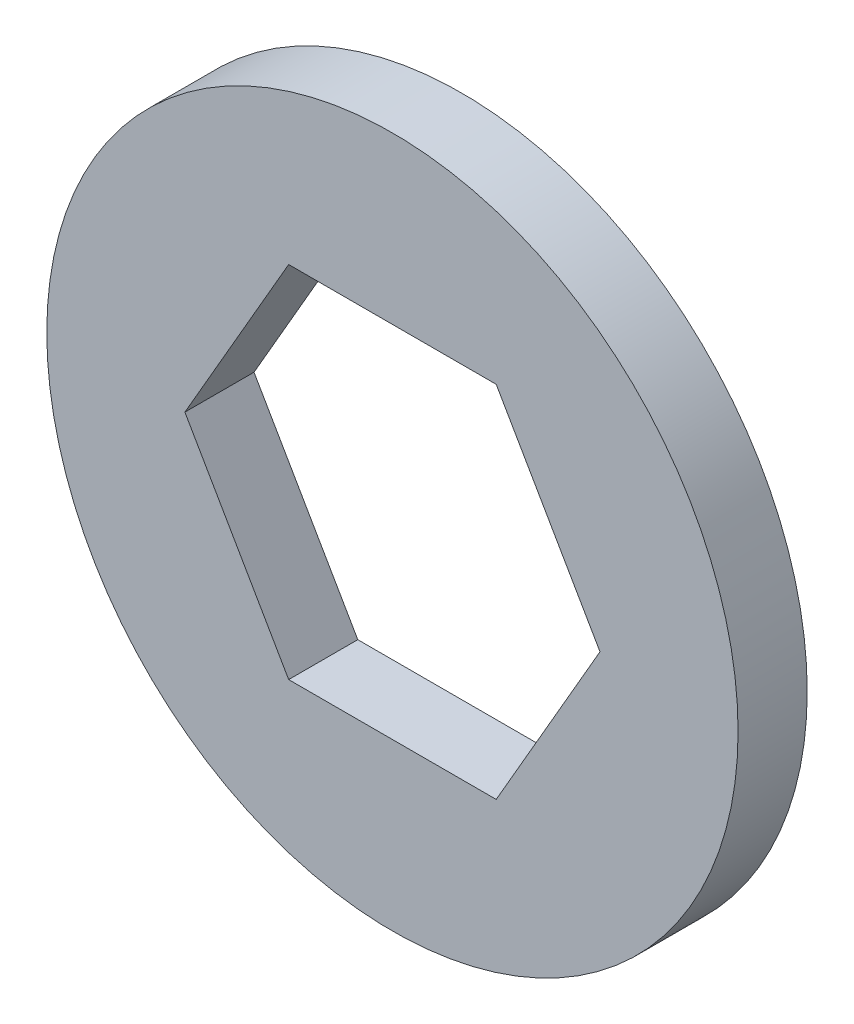
ISO-10303-21;
HEADER;
FILE_DESCRIPTION(('STEP AP214'),'2;1');
FILE_NAME('part.step','',(''),(''),'','','');
FILE_SCHEMA(('AUTOMOTIVE_DESIGN { 1 0 10303 214 1 1 1 1 }'));
ENDSEC;
DATA;
#1=APPLICATION_CONTEXT('core data for automotive mechanical design processes');
#2=APPLICATION_PROTOCOL_DEFINITION('international standard','automotive_design',2000,#1);
#3=PRODUCT_CONTEXT('',#1,'mechanical');
#4=PRODUCT('Part','Part','',(#3));
#5=PRODUCT_RELATED_PRODUCT_CATEGORY('part','',(#4));
#6=PRODUCT_DEFINITION_FORMATION('','',#4);
#7=PRODUCT_DEFINITION_CONTEXT('part definition',#1,'design');
#8=PRODUCT_DEFINITION('design','',#6,#7);
#9=PRODUCT_DEFINITION_SHAPE('','',#8);
#10=(LENGTH_UNIT() NAMED_UNIT(*) SI_UNIT(.MILLI.,.METRE.));
#11=(NAMED_UNIT(*) PLANE_ANGLE_UNIT() SI_UNIT($,.RADIAN.));
#12=(NAMED_UNIT(*) SI_UNIT($,.STERADIAN.) SOLID_ANGLE_UNIT());
#13=UNCERTAINTY_MEASURE_WITH_UNIT(LENGTH_MEASURE(1.E-05),#10,'distance_accuracy_value','');
#14=(GEOMETRIC_REPRESENTATION_CONTEXT(3) GLOBAL_UNCERTAINTY_ASSIGNED_CONTEXT((#13)) GLOBAL_UNIT_ASSIGNED_CONTEXT((#10,
#11,#12)) REPRESENTATION_CONTEXT('',''));
#15=CARTESIAN_POINT('',(0.,0.,0.));
#16=DIRECTION('',(0.,0.,1.));
#17=DIRECTION('',(1.,0.,0.));
#18=AXIS2_PLACEMENT_3D('',#15,#16,#17);
#19=CARTESIAN_POINT('',(0.,0.,2.54));
#20=DIRECTION('',(0.,0.,1.));
#21=DIRECTION('',(1.,0.,0.));
#22=AXIS2_PLACEMENT_3D('',#19,#20,#21);
#23=PLANE('',#22);
#24=CARTESIAN_POINT('',(0.,0.,2.54));
#25=DIRECTION('',(0.,0.,1.));
#26=DIRECTION('',(1.,0.,0.));
#27=AXIS2_PLACEMENT_3D('',#24,#25,#26);
#28=CIRCLE('',#27,12.7);
#29=CARTESIAN_POINT('',(12.7,0.,2.54));
#30=VERTEX_POINT('',#29);
#31=EDGE_CURVE('E11',#30,#30,#28,.T.);
#32=ORIENTED_EDGE('',*,*,#31,.T.);
#33=EDGE_LOOP('',(#32));
#34=FACE_BOUND('',#33,.T.);
#35=DIRECTION('',(0.5,0.866025403784438,0.));
#36=VECTOR('',#35,1.);
#37=CARTESIAN_POINT('',(3.81282117772829,-6.604,2.54));
#38=LINE('',#37,#36);
#39=CARTESIAN_POINT('',(3.81282117772829,-6.604,2.54));
#40=VERTEX_POINT('',#39);
#41=CARTESIAN_POINT('',(7.62564235545658,0.,2.54));
#42=VERTEX_POINT('',#41);
#43=EDGE_CURVE('E98',#40,#42,#38,.T.);
#44=ORIENTED_EDGE('',*,*,#43,.F.);
#45=DIRECTION('',(1.,0.,0.));
#46=VECTOR('',#45,1.);
#47=CARTESIAN_POINT('',(-3.81282117772829,-6.604,2.54));
#48=LINE('',#47,#46);
#49=CARTESIAN_POINT('',(-3.81282117772829,-6.604,2.54));
#50=VERTEX_POINT('',#49);
#51=EDGE_CURVE('E90',#50,#40,#48,.T.);
#52=ORIENTED_EDGE('',*,*,#51,.F.);
#53=DIRECTION('',(0.5,-0.866025403784439,0.));
#54=VECTOR('',#53,1.);
#55=CARTESIAN_POINT('',(-7.62564235545658,0.,2.54));
#56=LINE('',#55,#54);
#57=CARTESIAN_POINT('',(-7.62564235545658,0.,2.54));
#58=VERTEX_POINT('',#57);
#59=EDGE_CURVE('E118',#58,#50,#56,.T.);
#60=ORIENTED_EDGE('',*,*,#59,.F.);
#61=DIRECTION('',(-0.5,-0.866025403784438,0.));
#62=VECTOR('',#61,1.);
#63=CARTESIAN_POINT('',(-3.81282117772829,6.604,2.54));
#64=LINE('',#63,#62);
#65=CARTESIAN_POINT('',(-3.81282117772829,6.604,2.54));
#66=VERTEX_POINT('',#65);
#67=EDGE_CURVE('E116',#66,#58,#64,.T.);
#68=ORIENTED_EDGE('',*,*,#67,.F.);
#69=DIRECTION('',(-1.,0.,0.));
#70=VECTOR('',#69,1.);
#71=CARTESIAN_POINT('',(3.81282117772829,6.604,2.54));
#72=LINE('',#71,#70);
#73=CARTESIAN_POINT('',(3.81282117772829,6.604,2.54));
#74=VERTEX_POINT('',#73);
#75=EDGE_CURVE('E112',#74,#66,#72,.T.);
#76=ORIENTED_EDGE('',*,*,#75,.F.);
#77=DIRECTION('',(-0.5,0.866025403784439,0.));
#78=VECTOR('',#77,1.);
#79=CARTESIAN_POINT('',(7.62564235545658,0.,2.54));
#80=LINE('',#79,#78);
#81=EDGE_CURVE('E110',#42,#74,#80,.T.);
#82=ORIENTED_EDGE('',*,*,#81,.F.);
#83=EDGE_LOOP('',(#44,#52,#60,#68,#76,#82));
#84=FACE_BOUND('',#83,.T.);
#85=ADVANCED_FACE('F37',(#34,#84),#23,.T.);
#86=CARTESIAN_POINT('',(0.,0.,0.));
#87=DIRECTION('',(0.,0.,1.));
#88=DIRECTION('',(1.,0.,0.));
#89=AXIS2_PLACEMENT_3D('',#86,#87,#88);
#90=PLANE('',#89);
#91=CARTESIAN_POINT('',(0.,0.,0.));
#92=DIRECTION('',(0.,0.,1.));
#93=DIRECTION('',(1.,0.,0.));
#94=AXIS2_PLACEMENT_3D('',#91,#92,#93);
#95=CIRCLE('',#94,12.7);
#96=CARTESIAN_POINT('',(12.7,0.,0.));
#97=VERTEX_POINT('',#96);
#98=EDGE_CURVE('E41',#97,#97,#95,.T.);
#99=ORIENTED_EDGE('',*,*,#98,.F.);
#100=EDGE_LOOP('',(#99));
#101=FACE_BOUND('',#100,.T.);
#102=DIRECTION('',(1.,0.,0.));
#103=VECTOR('',#102,1.);
#104=CARTESIAN_POINT('',(-3.81282117772829,-6.604,0.));
#105=LINE('',#104,#103);
#106=CARTESIAN_POINT('',(-3.81282117772829,-6.604,0.));
#107=VERTEX_POINT('',#106);
#108=CARTESIAN_POINT('',(3.81282117772829,-6.604,0.));
#109=VERTEX_POINT('',#108);
#110=EDGE_CURVE('E60',#107,#109,#105,.T.);
#111=ORIENTED_EDGE('',*,*,#110,.T.);
#112=DIRECTION('',(0.5,0.866025403784438,0.));
#113=VECTOR('',#112,1.);
#114=CARTESIAN_POINT('',(3.81282117772829,-6.604,0.));
#115=LINE('',#114,#113);
#116=CARTESIAN_POINT('',(7.62564235545658,0.,0.));
#117=VERTEX_POINT('',#116);
#118=EDGE_CURVE('E105',#109,#117,#115,.T.);
#119=ORIENTED_EDGE('',*,*,#118,.T.);
#120=DIRECTION('',(-0.5,0.866025403784439,0.));
#121=VECTOR('',#120,1.);
#122=CARTESIAN_POINT('',(7.62564235545658,0.,0.));
#123=LINE('',#122,#121);
#124=CARTESIAN_POINT('',(3.81282117772829,6.604,0.));
#125=VERTEX_POINT('',#124);
#126=EDGE_CURVE('E122',#117,#125,#123,.T.);
#127=ORIENTED_EDGE('',*,*,#126,.T.);
#128=DIRECTION('',(-1.,0.,0.));
#129=VECTOR('',#128,1.);
#130=CARTESIAN_POINT('',(3.81282117772829,6.604,0.));
#131=LINE('',#130,#129);
#132=CARTESIAN_POINT('',(-3.81282117772829,6.604,0.));
#133=VERTEX_POINT('',#132);
#134=EDGE_CURVE('E125',#125,#133,#131,.T.);
#135=ORIENTED_EDGE('',*,*,#134,.T.);
#136=DIRECTION('',(-0.5,-0.866025403784438,0.));
#137=VECTOR('',#136,1.);
#138=CARTESIAN_POINT('',(-3.81282117772829,6.604,0.));
#139=LINE('',#138,#137);
#140=CARTESIAN_POINT('',(-7.62564235545658,0.,0.));
#141=VERTEX_POINT('',#140);
#142=EDGE_CURVE('E128',#133,#141,#139,.T.);
#143=ORIENTED_EDGE('',*,*,#142,.T.);
#144=DIRECTION('',(0.5,-0.866025403784439,0.));
#145=VECTOR('',#144,1.);
#146=CARTESIAN_POINT('',(-7.62564235545658,0.,0.));
#147=LINE('',#146,#145);
#148=EDGE_CURVE('E99',#141,#107,#147,.T.);
#149=ORIENTED_EDGE('',*,*,#148,.T.);
#150=EDGE_LOOP('',(#111,#119,#127,#135,#143,#149));
#151=FACE_BOUND('',#150,.T.);
#152=ADVANCED_FACE('F145',(#101,#151),#90,.F.);
#153=CARTESIAN_POINT('',(0.,0.,2.54));
#154=DIRECTION('',(0.,0.,-1.));
#155=DIRECTION('',(-1.,0.,0.));
#156=AXIS2_PLACEMENT_3D('',#153,#154,#155);
#157=CYLINDRICAL_SURFACE('',#156,12.7);
#158=ORIENTED_EDGE('',*,*,#31,.F.);
#159=EDGE_LOOP('',(#158));
#160=FACE_BOUND('',#159,.T.);
#161=ORIENTED_EDGE('',*,*,#98,.T.);
#162=EDGE_LOOP('',(#161));
#163=FACE_BOUND('',#162,.T.);
#164=ADVANCED_FACE('F39',(#160,#163),#157,.T.);
#165=CARTESIAN_POINT('',(-3.81282117772829,-6.604,2.54));
#166=DIRECTION('',(0.,1.,0.));
#167=DIRECTION('',(0.,0.,1.));
#168=AXIS2_PLACEMENT_3D('',#165,#166,#167);
#169=PLANE('',#168);
#170=ORIENTED_EDGE('',*,*,#110,.F.);
#171=DIRECTION('',(0.,0.,-1.));
#172=VECTOR('',#171,1.);
#173=CARTESIAN_POINT('',(-3.81282117772829,-6.604,2.54));
#174=LINE('',#173,#172);
#175=EDGE_CURVE('E94',#50,#107,#174,.T.);
#176=ORIENTED_EDGE('',*,*,#175,.F.);
#177=ORIENTED_EDGE('',*,*,#51,.T.);
#178=DIRECTION('',(0.,0.,-1.));
#179=VECTOR('',#178,1.);
#180=CARTESIAN_POINT('',(3.81282117772829,-6.604,2.54));
#181=LINE('',#180,#179);
#182=EDGE_CURVE('E93',#40,#109,#181,.T.);
#183=ORIENTED_EDGE('',*,*,#182,.T.);
#184=EDGE_LOOP('',(#170,#176,#177,#183));
#185=FACE_BOUND('',#184,.T.);
#186=ADVANCED_FACE('F92',(#185),#169,.T.);
#187=CARTESIAN_POINT('',(3.81282117772829,-6.604,2.54));
#188=DIRECTION('',(-0.866025403784439,0.5,0.));
#189=DIRECTION('',(-0.5,-0.866025403784438,0.));
#190=AXIS2_PLACEMENT_3D('',#187,#188,#189);
#191=PLANE('',#190);
#192=ORIENTED_EDGE('',*,*,#118,.F.);
#193=ORIENTED_EDGE('',*,*,#182,.F.);
#194=ORIENTED_EDGE('',*,*,#43,.T.);
#195=DIRECTION('',(0.,0.,-1.));
#196=VECTOR('',#195,1.);
#197=CARTESIAN_POINT('',(7.62564235545658,0.,2.54));
#198=LINE('',#197,#196);
#199=EDGE_CURVE('E106',#42,#117,#198,.T.);
#200=ORIENTED_EDGE('',*,*,#199,.T.);
#201=EDGE_LOOP('',(#192,#193,#194,#200));
#202=FACE_BOUND('',#201,.T.);
#203=ADVANCED_FACE('F102',(#202),#191,.T.);
#204=CARTESIAN_POINT('',(7.62564235545658,0.,2.54));
#205=DIRECTION('',(-0.866025403784439,-0.5,0.));
#206=DIRECTION('',(0.5,-0.866025403784439,0.));
#207=AXIS2_PLACEMENT_3D('',#204,#205,#206);
#208=PLANE('',#207);
#209=ORIENTED_EDGE('',*,*,#126,.F.);
#210=ORIENTED_EDGE('',*,*,#199,.F.);
#211=ORIENTED_EDGE('',*,*,#81,.T.);
#212=DIRECTION('',(0.,0.,-1.));
#213=VECTOR('',#212,1.);
#214=CARTESIAN_POINT('',(3.81282117772829,6.604,2.54));
#215=LINE('',#214,#213);
#216=EDGE_CURVE('E137',#74,#125,#215,.T.);
#217=ORIENTED_EDGE('',*,*,#216,.T.);
#218=EDGE_LOOP('',(#209,#210,#211,#217));
#219=FACE_BOUND('',#218,.T.);
#220=ADVANCED_FACE('F141',(#219),#208,.T.);
#221=CARTESIAN_POINT('',(3.81282117772829,6.604,2.54));
#222=DIRECTION('',(0.,-1.,0.));
#223=DIRECTION('',(1.,0.,0.));
#224=AXIS2_PLACEMENT_3D('',#221,#222,#223);
#225=PLANE('',#224);
#226=ORIENTED_EDGE('',*,*,#134,.F.);
#227=ORIENTED_EDGE('',*,*,#216,.F.);
#228=ORIENTED_EDGE('',*,*,#75,.T.);
#229=DIRECTION('',(0.,0.,-1.));
#230=VECTOR('',#229,1.);
#231=CARTESIAN_POINT('',(-3.81282117772829,6.604,2.54));
#232=LINE('',#231,#230);
#233=EDGE_CURVE('E135',#66,#133,#232,.T.);
#234=ORIENTED_EDGE('',*,*,#233,.T.);
#235=EDGE_LOOP('',(#226,#227,#228,#234));
#236=FACE_BOUND('',#235,.T.);
#237=ADVANCED_FACE('F153',(#236),#225,.T.);
#238=CARTESIAN_POINT('',(-3.81282117772829,6.604,2.54));
#239=DIRECTION('',(0.866025403784439,-0.5,0.));
#240=DIRECTION('',(0.5,0.866025403784438,0.));
#241=AXIS2_PLACEMENT_3D('',#238,#239,#240);
#242=PLANE('',#241);
#243=ORIENTED_EDGE('',*,*,#142,.F.);
#244=ORIENTED_EDGE('',*,*,#233,.F.);
#245=ORIENTED_EDGE('',*,*,#67,.T.);
#246=DIRECTION('',(0.,0.,-1.));
#247=VECTOR('',#246,1.);
#248=CARTESIAN_POINT('',(-7.62564235545658,0.,2.54));
#249=LINE('',#248,#247);
#250=EDGE_CURVE('E52',#58,#141,#249,.T.);
#251=ORIENTED_EDGE('',*,*,#250,.T.);
#252=EDGE_LOOP('',(#243,#244,#245,#251));
#253=FACE_BOUND('',#252,.T.);
#254=ADVANCED_FACE('F151',(#253),#242,.T.);
#255=CARTESIAN_POINT('',(-7.62564235545658,0.,2.54));
#256=DIRECTION('',(0.866025403784439,0.5,0.));
#257=DIRECTION('',(-0.5,0.866025403784439,0.));
#258=AXIS2_PLACEMENT_3D('',#255,#256,#257);
#259=PLANE('',#258);
#260=ORIENTED_EDGE('',*,*,#148,.F.);
#261=ORIENTED_EDGE('',*,*,#250,.F.);
#262=ORIENTED_EDGE('',*,*,#59,.T.);
#263=ORIENTED_EDGE('',*,*,#175,.T.);
#264=EDGE_LOOP('',(#260,#261,#262,#263));
#265=FACE_BOUND('',#264,.T.);
#266=ADVANCED_FACE('F147',(#265),#259,.T.);
#267=CLOSED_SHELL('',(#85,#152,#164,#186,#203,#220,#237,#254,#266));
#268=MANIFOLD_SOLID_BREP('B2',#267);
#269=ADVANCED_BREP_SHAPE_REPRESENTATION('',(#18,#268),#14);
#270=SHAPE_DEFINITION_REPRESENTATION(#9,#269);
ENDSEC;
END-ISO-10303-21;
